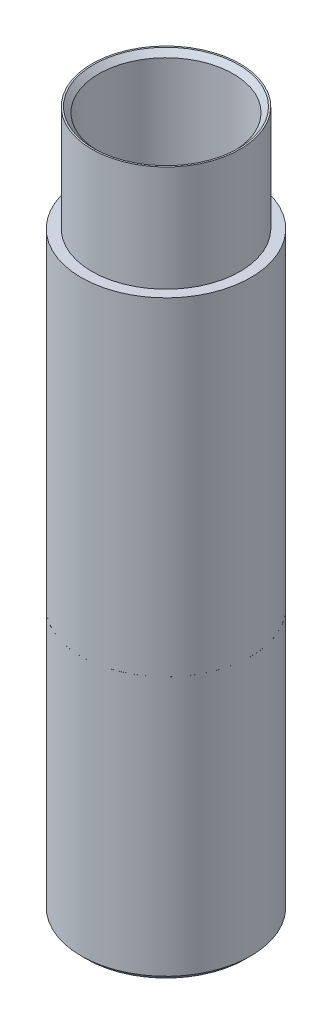
ISO-10303-21;
HEADER;
FILE_DESCRIPTION(('STEP AP214'),'2;1');
FILE_NAME('part.step','',(''),(''),'','','');
FILE_SCHEMA(('AUTOMOTIVE_DESIGN { 1 0 10303 214 1 1 1 1 }'));
ENDSEC;
DATA;
#1=APPLICATION_CONTEXT('core data for automotive mechanical design processes');
#2=APPLICATION_PROTOCOL_DEFINITION('international standard','automotive_design',2000,#1);
#3=PRODUCT_CONTEXT('',#1,'mechanical');
#4=PRODUCT('Part','Part','',(#3));
#5=PRODUCT_RELATED_PRODUCT_CATEGORY('part','',(#4));
#6=PRODUCT_DEFINITION_FORMATION('','',#4);
#7=PRODUCT_DEFINITION_CONTEXT('part definition',#1,'design');
#8=PRODUCT_DEFINITION('design','',#6,#7);
#9=PRODUCT_DEFINITION_SHAPE('','',#8);
#10=(LENGTH_UNIT() NAMED_UNIT(*) SI_UNIT(.MILLI.,.METRE.));
#11=(NAMED_UNIT(*) PLANE_ANGLE_UNIT() SI_UNIT($,.RADIAN.));
#12=(NAMED_UNIT(*) SI_UNIT($,.STERADIAN.) SOLID_ANGLE_UNIT());
#13=UNCERTAINTY_MEASURE_WITH_UNIT(LENGTH_MEASURE(1.E-05),#10,'distance_accuracy_value','');
#14=(GEOMETRIC_REPRESENTATION_CONTEXT(3) GLOBAL_UNCERTAINTY_ASSIGNED_CONTEXT((#13)) GLOBAL_UNIT_ASSIGNED_CONTEXT((#10,
#11,#12)) REPRESENTATION_CONTEXT('',''));
#15=CARTESIAN_POINT('',(0.,0.,0.));
#16=DIRECTION('',(0.,0.,1.));
#17=DIRECTION('',(1.,0.,0.));
#18=AXIS2_PLACEMENT_3D('',#15,#16,#17);
#19=CARTESIAN_POINT('',(0.,0.,0.));
#20=DIRECTION('',(0.,-1.,0.));
#21=DIRECTION('',(0.,0.,-1.));
#22=AXIS2_PLACEMENT_3D('',#19,#20,#21);
#23=CYLINDRICAL_SURFACE('',#22,7.375);
#24=CARTESIAN_POINT('',(0.,25.,0.));
#25=DIRECTION('',(0.,-1.,0.));
#26=DIRECTION('',(0.,0.,-1.));
#27=AXIS2_PLACEMENT_3D('',#24,#25,#26);
#28=CIRCLE('',#27,7.375);
#29=CARTESIAN_POINT('',(0.,25.,-7.375));
#30=VERTEX_POINT('',#29);
#31=EDGE_CURVE('P0_E21',#30,#30,#28,.T.);
#32=ORIENTED_EDGE('',*,*,#31,.T.);
#33=EDGE_LOOP('',(#32));
#34=FACE_BOUND('',#33,.T.);
#35=CARTESIAN_POINT('',(0.,0.,0.));
#36=DIRECTION('',(0.,-1.,0.));
#37=DIRECTION('',(0.,0.,-1.));
#38=AXIS2_PLACEMENT_3D('',#35,#36,#37);
#39=CIRCLE('',#38,7.375);
#40=CARTESIAN_POINT('',(0.,0.,-7.375));
#41=VERTEX_POINT('',#40);
#42=EDGE_CURVE('P0_E11',#41,#41,#39,.F.);
#43=ORIENTED_EDGE('',*,*,#42,.T.);
#44=EDGE_LOOP('',(#43));
#45=FACE_BOUND('',#44,.T.);
#46=ADVANCED_FACE('P0_F17',(#34,#45),#23,.T.);
#47=CARTESIAN_POINT('',(0.,25.,0.));
#48=DIRECTION('',(0.,-1.,0.));
#49=DIRECTION('',(0.,0.,-1.));
#50=AXIS2_PLACEMENT_3D('',#47,#48,#49);
#51=PLANE('',#50);
#52=ORIENTED_EDGE('',*,*,#31,.F.);
#53=EDGE_LOOP('',(#52));
#54=FACE_BOUND('',#53,.T.);
#55=CARTESIAN_POINT('',(-8.,25.,0.));
#56=CARTESIAN_POINT('',(-7.99990265013749,25.,-0.734238479496044));
#57=CARTESIAN_POINT('',(-7.8664429473326,25.,-1.45570441929716));
#58=CARTESIAN_POINT('',(-7.72495795081887,25.,-2.22055406179003));
#59=CARTESIAN_POINT('',(-7.43830640849944,25.,-2.94475767649498));
#60=CARTESIAN_POINT('',(-7.14001112713963,25.,-3.69837832427605));
#61=CARTESIAN_POINT('',(-6.69596408974921,25.,-4.37767802708114));
#62=CARTESIAN_POINT('',(-6.24297994954599,25.,-5.07064964023238));
#63=CARTESIAN_POINT('',(-5.65685424949238,25.,-5.65685424949238));
#64=CARTESIAN_POINT('',(-5.07148593780608,25.,-6.24230136841904));
#65=CARTESIAN_POINT('',(-4.37767802708114,25.,-6.69596408974921));
#66=CARTESIAN_POINT('',(-3.69931538180431,25.,-7.1395275587553));
#67=CARTESIAN_POINT('',(-2.94475767649498,25.,-7.43830640849944));
#68=CARTESIAN_POINT('',(-2.22156295997012,25.,-7.72466659543274));
#69=CARTESIAN_POINT('',(-1.45570441929716,25.,-7.8664429473326));
#70=CARTESIAN_POINT('',(-0.734508562176014,25.,-7.99995130716374));
#71=CARTESIAN_POINT('',(0.,25.,-8.));
#72=CARTESIAN_POINT('',(0.733449371100174,25.,-8.00004862261922));
#73=CARTESIAN_POINT('',(1.45570441929716,25.,-7.86644294733259));
#74=CARTESIAN_POINT('',(2.22055406180139,25.,-7.72495795081425));
#75=CARTESIAN_POINT('',(2.94475767649498,25.,-7.43830640849944));
#76=CARTESIAN_POINT('',(3.69837832427386,25.,-7.14001112714063));
#77=CARTESIAN_POINT('',(4.37767802708114,25.,-6.69596408974921));
#78=CARTESIAN_POINT('',(5.07064964023111,25.,-6.24297994954726));
#79=CARTESIAN_POINT('',(5.65685424949238,25.,-5.65685424949238));
#80=CARTESIAN_POINT('',(6.24230136841836,25.,-5.07148593780675));
#81=CARTESIAN_POINT('',(6.69596408974921,25.,-4.37767802708114));
#82=CARTESIAN_POINT('',(7.13952755875318,25.,-3.6993153818079));
#83=CARTESIAN_POINT('',(7.43830640849944,25.,-2.94475767649498));
#84=CARTESIAN_POINT('',(7.72466659543293,25.,-2.22156295997131));
#85=CARTESIAN_POINT('',(7.8664429473326,25.,-1.45570441929716));
#86=CARTESIAN_POINT('',(7.99990257942877,25.,-0.734771783448102));
#87=CARTESIAN_POINT('',(8.,25.,0.));
#88=B_SPLINE_CURVE_WITH_KNOTS('',2,(#55,#56,#57,#58,#59,#60,#61,#62,#63,#64,#65,#66,#67,#68,#69,
#70,#71,#72,#73,#74,#75,#76,#77,#78,#79,#80,#81,#82,#83,#84,#85,#86,#87),.UNSPECIFIED.,.F.,.F.,
(3,2,2,2,2,2,2,2,2,2,2,2,2,2,2,2,3),(0.,0.0625,0.125,0.1875,0.25,0.3125,0.375,0.4375,0.5,0.5625,
0.625,0.6875,0.75,0.8125,0.875,0.9375,1.),.UNSPECIFIED.);
#89=CARTESIAN_POINT('',(-8.,25.,0.));
#90=VERTEX_POINT('',#89);
#91=CARTESIAN_POINT('',(8.,25.,0.));
#92=VERTEX_POINT('',#91);
#93=EDGE_CURVE('P0_E31',#90,#92,#88,.T.);
#94=ORIENTED_EDGE('',*,*,#93,.T.);
#95=CARTESIAN_POINT('',(8.,25.,0.));
#96=CARTESIAN_POINT('',(7.99990265013749,25.,0.734238479496044));
#97=CARTESIAN_POINT('',(7.8664429473326,25.,1.45570441929716));
#98=CARTESIAN_POINT('',(7.72495795081887,25.,2.22055406179003));
#99=CARTESIAN_POINT('',(7.43830640849944,25.,2.94475767649498));
#100=CARTESIAN_POINT('',(7.14001112713963,25.,3.69837832427605));
#101=CARTESIAN_POINT('',(6.69596408974921,25.,4.37767802708114));
#102=CARTESIAN_POINT('',(6.24297994954599,25.,5.07064964023238));
#103=CARTESIAN_POINT('',(5.65685424949238,25.,5.65685424949238));
#104=CARTESIAN_POINT('',(5.07148593780608,25.,6.24230136841904));
#105=CARTESIAN_POINT('',(4.37767802708114,25.,6.69596408974921));
#106=CARTESIAN_POINT('',(3.69931538180431,25.,7.1395275587553));
#107=CARTESIAN_POINT('',(2.94475767649498,25.,7.43830640849944));
#108=CARTESIAN_POINT('',(2.22156295997012,25.,7.72466659543274));
#109=CARTESIAN_POINT('',(1.45570441929716,25.,7.8664429473326));
#110=CARTESIAN_POINT('',(0.734508562176014,25.,7.99995130716374));
#111=CARTESIAN_POINT('',(0.,25.,8.));
#112=CARTESIAN_POINT('',(-0.733449371100174,25.,8.00004862261922));
#113=CARTESIAN_POINT('',(-1.45570441929716,25.,7.86644294733259));
#114=CARTESIAN_POINT('',(-2.22055406180139,25.,7.72495795081425));
#115=CARTESIAN_POINT('',(-2.94475767649498,25.,7.43830640849944));
#116=CARTESIAN_POINT('',(-3.69837832427386,25.,7.14001112714063));
#117=CARTESIAN_POINT('',(-4.37767802708114,25.,6.69596408974921));
#118=CARTESIAN_POINT('',(-5.07064964023111,25.,6.24297994954726));
#119=CARTESIAN_POINT('',(-5.65685424949238,25.,5.65685424949238));
#120=CARTESIAN_POINT('',(-6.24230136841836,25.,5.07148593780675));
#121=CARTESIAN_POINT('',(-6.69596408974921,25.,4.37767802708114));
#122=CARTESIAN_POINT('',(-7.13952755875318,25.,3.6993153818079));
#123=CARTESIAN_POINT('',(-7.43830640849944,25.,2.94475767649498));
#124=CARTESIAN_POINT('',(-7.72466659543293,25.,2.22156295997131));
#125=CARTESIAN_POINT('',(-7.8664429473326,25.,1.45570441929716));
#126=CARTESIAN_POINT('',(-7.99990257942877,25.,0.734771783448102));
#127=CARTESIAN_POINT('',(-8.,25.,0.));
#128=B_SPLINE_CURVE_WITH_KNOTS('',2,(#95,#96,#97,#98,#99,#100,#101,#102,#103,#104,#105,#106,
#107,#108,#109,#110,#111,#112,#113,#114,#115,#116,#117,#118,#119,#120,#121,#122,#123,#124,#125,
#126,#127),.UNSPECIFIED.,.F.,.F.,(3,2,2,2,2,2,2,2,2,2,2,2,2,2,2,2,3),(0.,0.0625,0.125,0.1875,
0.25,0.3125,0.375,0.4375,0.5,0.5625,0.625,0.6875,0.75,0.8125,0.875,0.9375,1.),.UNSPECIFIED.);
#129=EDGE_CURVE('P0_E34',#92,#90,#128,.T.);
#130=ORIENTED_EDGE('',*,*,#129,.T.);
#131=EDGE_LOOP('',(#94,#130));
#132=FACE_BOUND('',#131,.T.);
#133=ADVANCED_FACE('P0_F18',(#54,#132),#51,.T.);
#134=OPEN_SHELL('',(#46,#133));
#135=SHELL_BASED_SURFACE_MODEL('P0_B1',(#134));
#136=CARTESIAN_POINT('',(0.,65.9999999999172,0.));
#137=DIRECTION('',(0.,1.,0.));
#138=DIRECTION('',(0.,0.,1.));
#139=AXIS2_PLACEMENT_3D('',#136,#137,#138);
#140=CONICAL_SURFACE('',#139,6.84999999992897,0.785398163454292);
#141=CARTESIAN_POINT('',(0.,65.5,0.));
#142=DIRECTION('',(0.,1.,0.));
#143=DIRECTION('',(0.,0.,1.));
#144=AXIS2_PLACEMENT_3D('',#141,#142,#143);
#145=CIRCLE('',#144,6.35);
#146=CARTESIAN_POINT('',(0.,65.5,6.35));
#147=VERTEX_POINT('',#146);
#148=EDGE_CURVE('P1_E30',#147,#147,#145,.F.);
#149=ORIENTED_EDGE('',*,*,#148,.T.);
#150=EDGE_LOOP('',(#149));
#151=FACE_BOUND('',#150,.T.);
#152=CARTESIAN_POINT('',(0.,65.9999999999741,0.));
#153=DIRECTION('',(0.,1.,0.));
#154=DIRECTION('',(0.,0.,1.));
#155=AXIS2_PLACEMENT_3D('',#152,#153,#154);
#156=CIRCLE('',#155,6.84999999998581);
#157=CARTESIAN_POINT('',(0.,65.9999999999741,6.84999999998581));
#158=VERTEX_POINT('',#157);
#159=EDGE_CURVE('P1_E18',#158,#158,#156,.F.);
#160=ORIENTED_EDGE('',*,*,#159,.F.);
#161=EDGE_LOOP('',(#160));
#162=FACE_BOUND('',#161,.T.);
#163=ADVANCED_FACE('P1_F15',(#151,#162),#140,.F.);
#164=CARTESIAN_POINT('',(0.,66.,0.));
#165=DIRECTION('',(0.,1.,0.));
#166=DIRECTION('',(0.,0.,1.));
#167=AXIS2_PLACEMENT_3D('',#164,#165,#166);
#168=PLANE('',#167);
#169=ORIENTED_EDGE('',*,*,#159,.T.);
#170=EDGE_LOOP('',(#169));
#171=FACE_BOUND('',#170,.T.);
#172=CARTESIAN_POINT('',(0.,66.,0.));
#173=DIRECTION('',(0.,1.,0.));
#174=DIRECTION('',(0.,0.,1.));
#175=AXIS2_PLACEMENT_3D('',#172,#173,#174);
#176=CIRCLE('',#175,7.);
#177=CARTESIAN_POINT('',(0.,66.,7.));
#178=VERTEX_POINT('',#177);
#179=EDGE_CURVE('P1_E32',#178,#178,#176,.F.);
#180=ORIENTED_EDGE('',*,*,#179,.F.);
#181=EDGE_LOOP('',(#180));
#182=FACE_BOUND('',#181,.T.);
#183=ADVANCED_FACE('P1_F46',(#171,#182),#168,.T.);
#184=CARTESIAN_POINT('',(0.,0.,0.));
#185=DIRECTION('',(0.,1.,0.));
#186=DIRECTION('',(0.,0.,1.));
#187=AXIS2_PLACEMENT_3D('',#184,#185,#186);
#188=CYLINDRICAL_SURFACE('',#187,6.35);
#189=CARTESIAN_POINT('',(0.,0.,0.));
#190=DIRECTION('',(0.,1.,0.));
#191=DIRECTION('',(0.,0.,1.));
#192=AXIS2_PLACEMENT_3D('',#189,#190,#191);
#193=CIRCLE('',#192,6.35);
#194=CARTESIAN_POINT('',(0.,0.,6.35));
#195=VERTEX_POINT('',#194);
#196=EDGE_CURVE('P1_E39',#195,#195,#193,.F.);
#197=ORIENTED_EDGE('',*,*,#196,.T.);
#198=EDGE_LOOP('',(#197));
#199=FACE_BOUND('',#198,.T.);
#200=ORIENTED_EDGE('',*,*,#148,.F.);
#201=EDGE_LOOP('',(#200));
#202=FACE_BOUND('',#201,.T.);
#203=ADVANCED_FACE('P1_F48',(#199,#202),#188,.F.);
#204=CARTESIAN_POINT('',(0.,66.,0.));
#205=DIRECTION('',(0.,1.,0.));
#206=DIRECTION('',(0.,0.,1.));
#207=AXIS2_PLACEMENT_3D('',#204,#205,#206);
#208=CYLINDRICAL_SURFACE('',#207,7.);
#209=CARTESIAN_POINT('',(0.,56.,0.));
#210=DIRECTION('',(0.,1.,0.));
#211=DIRECTION('',(0.,0.,1.));
#212=AXIS2_PLACEMENT_3D('',#209,#210,#211);
#213=CIRCLE('',#212,7.);
#214=CARTESIAN_POINT('',(0.,56.,7.));
#215=VERTEX_POINT('',#214);
#216=EDGE_CURVE('P1_E36',#215,#215,#213,.F.);
#217=ORIENTED_EDGE('',*,*,#216,.F.);
#218=EDGE_LOOP('',(#217));
#219=FACE_BOUND('',#218,.T.);
#220=ORIENTED_EDGE('',*,*,#179,.T.);
#221=EDGE_LOOP('',(#220));
#222=FACE_BOUND('',#221,.T.);
#223=ADVANCED_FACE('P1_F44',(#219,#222),#208,.T.);
#224=CARTESIAN_POINT('',(0.,0.,0.));
#225=DIRECTION('',(0.,1.,0.));
#226=DIRECTION('',(0.,0.,1.));
#227=AXIS2_PLACEMENT_3D('',#224,#225,#226);
#228=PLANE('',#227);
#229=ORIENTED_EDGE('',*,*,#196,.F.);
#230=EDGE_LOOP('',(#229));
#231=FACE_BOUND('',#230,.T.);
#232=CARTESIAN_POINT('',(0.,1.12757025938492E-13,0.));
#233=DIRECTION('',(0.,1.,0.));
#234=DIRECTION('',(0.,0.,1.));
#235=AXIS2_PLACEMENT_3D('',#232,#233,#234);
#236=CIRCLE('',#235,7.49999999999989);
#237=CARTESIAN_POINT('',(0.,1.12757025938492E-13,7.49999999999989));
#238=VERTEX_POINT('',#237);
#239=EDGE_CURVE('P1_E27',#238,#238,#236,.T.);
#240=ORIENTED_EDGE('',*,*,#239,.F.);
#241=EDGE_LOOP('',(#240));
#242=FACE_BOUND('',#241,.T.);
#243=ADVANCED_FACE('P1_F73',(#231,#242),#228,.F.);
#244=CARTESIAN_POINT('',(0.,56.,0.));
#245=DIRECTION('',(0.,1.,0.));
#246=DIRECTION('',(0.,0.,1.));
#247=AXIS2_PLACEMENT_3D('',#244,#245,#246);
#248=PLANE('',#247);
#249=ORIENTED_EDGE('',*,*,#216,.T.);
#250=EDGE_LOOP('',(#249));
#251=FACE_BOUND('',#250,.T.);
#252=CARTESIAN_POINT('',(0.,56.,0.));
#253=DIRECTION('',(0.,1.,0.));
#254=DIRECTION('',(0.,0.,1.));
#255=AXIS2_PLACEMENT_3D('',#252,#253,#254);
#256=CIRCLE('',#255,8.);
#257=CARTESIAN_POINT('',(0.,56.,8.));
#258=VERTEX_POINT('',#257);
#259=EDGE_CURVE('P1_E22',#258,#258,#256,.F.);
#260=ORIENTED_EDGE('',*,*,#259,.F.);
#261=EDGE_LOOP('',(#260));
#262=FACE_BOUND('',#261,.T.);
#263=ADVANCED_FACE('P1_F67',(#251,#262),#248,.T.);
#264=CARTESIAN_POINT('',(0.,0.500000000000187,0.));
#265=DIRECTION('',(0.,1.,0.));
#266=DIRECTION('',(0.,0.,1.));
#267=AXIS2_PLACEMENT_3D('',#264,#265,#266);
#268=CONICAL_SURFACE('',#267,7.99999999999981,0.7853981633973);
#269=CARTESIAN_POINT('',(0.,0.5,0.));
#270=DIRECTION('',(0.,1.,0.));
#271=DIRECTION('',(0.,0.,1.));
#272=AXIS2_PLACEMENT_3D('',#269,#270,#271);
#273=CIRCLE('',#272,8.);
#274=CARTESIAN_POINT('',(0.,0.5,8.));
#275=VERTEX_POINT('',#274);
#276=EDGE_CURVE('P1_E10',#275,#275,#273,.T.);
#277=ORIENTED_EDGE('',*,*,#276,.F.);
#278=EDGE_LOOP('',(#277));
#279=FACE_BOUND('',#278,.T.);
#280=ORIENTED_EDGE('',*,*,#239,.T.);
#281=EDGE_LOOP('',(#280));
#282=FACE_BOUND('',#281,.T.);
#283=ADVANCED_FACE('P1_F61',(#279,#282),#268,.T.);
#284=CARTESIAN_POINT('',(0.,0.,0.));
#285=DIRECTION('',(0.,1.,0.));
#286=DIRECTION('',(0.,0.,1.));
#287=AXIS2_PLACEMENT_3D('',#284,#285,#286);
#288=CYLINDRICAL_SURFACE('',#287,8.);
#289=ORIENTED_EDGE('',*,*,#259,.T.);
#290=EDGE_LOOP('',(#289));
#291=FACE_BOUND('',#290,.T.);
#292=ORIENTED_EDGE('',*,*,#276,.T.);
#293=EDGE_LOOP('',(#292));
#294=FACE_BOUND('',#293,.T.);
#295=ADVANCED_FACE('P1_F59',(#291,#294),#288,.T.);
#296=CLOSED_SHELL('',(#163,#183,#203,#223,#243,#263,#283,#295));
#297=MANIFOLD_SOLID_BREP('P1_B1',#296);
#298=ADVANCED_BREP_SHAPE_REPRESENTATION('',(#18,#297),#14);
#299=MANIFOLD_SURFACE_SHAPE_REPRESENTATION('',(#18,#135),#14);
#300=SHAPE_REPRESENTATION('',(#18),#14);
#301=SHAPE_DEFINITION_REPRESENTATION(#9,#300);
#302=SHAPE_REPRESENTATION_RELATIONSHIP('','',#300,#298);
#303=SHAPE_REPRESENTATION_RELATIONSHIP('','',#300,#299);
ENDSEC;
END-ISO-10303-21;
